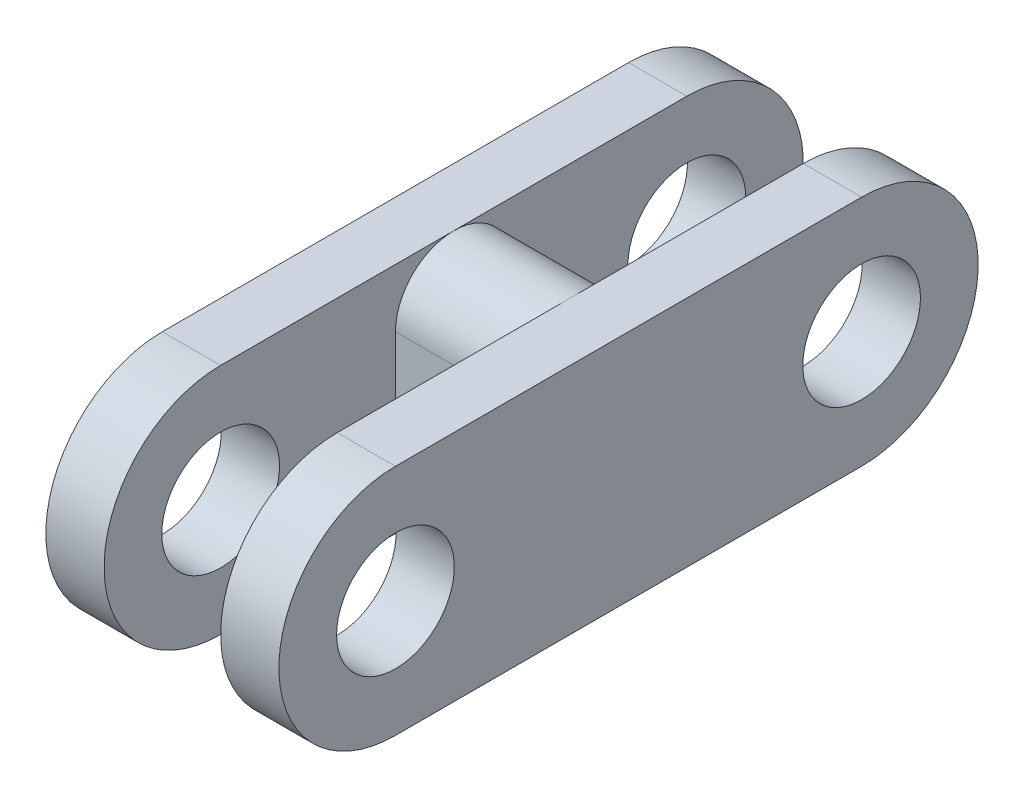
ISO-10303-21;
HEADER;
FILE_DESCRIPTION(('STEP AP214'),'2;1');
FILE_NAME('part.step','',(''),(''),'','','');
FILE_SCHEMA(('AUTOMOTIVE_DESIGN { 1 0 10303 214 1 1 1 1 }'));
ENDSEC;
DATA;
#1=APPLICATION_CONTEXT('core data for automotive mechanical design processes');
#2=APPLICATION_PROTOCOL_DEFINITION('international standard','automotive_design',2000,#1);
#3=PRODUCT_CONTEXT('',#1,'mechanical');
#4=PRODUCT('Part','Part','',(#3));
#5=PRODUCT_RELATED_PRODUCT_CATEGORY('part','',(#4));
#6=PRODUCT_DEFINITION_FORMATION('','',#4);
#7=PRODUCT_DEFINITION_CONTEXT('part definition',#1,'design');
#8=PRODUCT_DEFINITION('design','',#6,#7);
#9=PRODUCT_DEFINITION_SHAPE('','',#8);
#10=(LENGTH_UNIT() NAMED_UNIT(*) SI_UNIT(.MILLI.,.METRE.));
#11=(NAMED_UNIT(*) PLANE_ANGLE_UNIT() SI_UNIT($,.RADIAN.));
#12=(NAMED_UNIT(*) SI_UNIT($,.STERADIAN.) SOLID_ANGLE_UNIT());
#13=UNCERTAINTY_MEASURE_WITH_UNIT(LENGTH_MEASURE(1.E-05),#10,'distance_accuracy_value','');
#14=(GEOMETRIC_REPRESENTATION_CONTEXT(3) GLOBAL_UNCERTAINTY_ASSIGNED_CONTEXT((#13)) GLOBAL_UNIT_ASSIGNED_CONTEXT((#10,
#11,#12)) REPRESENTATION_CONTEXT('',''));
#15=CARTESIAN_POINT('',(0.,0.,0.));
#16=DIRECTION('',(0.,0.,1.));
#17=DIRECTION('',(1.,0.,0.));
#18=AXIS2_PLACEMENT_3D('',#15,#16,#17);
#19=CARTESIAN_POINT('',(2.5,-5.,5.));
#20=DIRECTION('',(-1.,0.,0.));
#21=DIRECTION('',(0.,0.,1.));
#22=AXIS2_PLACEMENT_3D('',#19,#20,#21);
#23=PLANE('',#22);
#24=CARTESIAN_POINT('',(2.5,-5.,25.));
#25=DIRECTION('',(-1.,0.,0.));
#26=DIRECTION('',(0.,0.,1.));
#27=AXIS2_PLACEMENT_3D('',#24,#25,#26);
#28=CIRCLE('',#27,2.52500000000001);
#29=CARTESIAN_POINT('',(2.5,-5.,27.525));
#30=VERTEX_POINT('',#29);
#31=EDGE_CURVE('E302',#30,#30,#28,.T.);
#32=ORIENTED_EDGE('',*,*,#31,.T.);
#33=EDGE_LOOP('',(#32));
#34=FACE_BOUND('',#33,.T.);
#35=DIRECTION('',(0.,-1.,0.));
#36=VECTOR('',#35,1.);
#37=CARTESIAN_POINT('',(2.5,-7.5,17.5));
#38=LINE('',#37,#36);
#39=CARTESIAN_POINT('',(2.5,-2.5,17.5));
#40=VERTEX_POINT('',#39);
#41=CARTESIAN_POINT('',(2.5,-7.5,17.5));
#42=VERTEX_POINT('',#41);
#43=EDGE_CURVE('E194',#40,#42,#38,.T.);
#44=ORIENTED_EDGE('',*,*,#43,.F.);
#45=CARTESIAN_POINT('',(2.5,-2.5,15.));
#46=DIRECTION('',(1.,0.,0.));
#47=DIRECTION('',(0.,0.,1.));
#48=AXIS2_PLACEMENT_3D('',#45,#46,#47);
#49=CIRCLE('',#48,2.5);
#50=CARTESIAN_POINT('',(2.5,0.,15.));
#51=VERTEX_POINT('',#50);
#52=EDGE_CURVE('E11',#51,#40,#49,.T.);
#53=ORIENTED_EDGE('',*,*,#52,.F.);
#54=DIRECTION('',(0.,0.,-1.));
#55=VECTOR('',#54,1.);
#56=CARTESIAN_POINT('',(2.5,0.,25.));
#57=LINE('',#56,#55);
#58=CARTESIAN_POINT('',(2.5,0.,25.));
#59=VERTEX_POINT('',#58);
#60=EDGE_CURVE('E221',#59,#51,#57,.T.);
#61=ORIENTED_EDGE('',*,*,#60,.F.);
#62=CARTESIAN_POINT('',(2.5,-5.,25.));
#63=DIRECTION('',(-1.,0.,0.));
#64=DIRECTION('',(0.,0.,1.));
#65=AXIS2_PLACEMENT_3D('',#62,#63,#64);
#66=CIRCLE('',#65,5.);
#67=CARTESIAN_POINT('',(2.5,-10.,25.));
#68=VERTEX_POINT('',#67);
#69=EDGE_CURVE('E217',#68,#59,#66,.T.);
#70=ORIENTED_EDGE('',*,*,#69,.F.);
#71=DIRECTION('',(0.,0.,1.));
#72=VECTOR('',#71,1.);
#73=CARTESIAN_POINT('',(2.5,-10.,5.));
#74=LINE('',#73,#72);
#75=CARTESIAN_POINT('',(2.5,-10.,15.));
#76=VERTEX_POINT('',#75);
#77=EDGE_CURVE('E212',#76,#68,#74,.T.);
#78=ORIENTED_EDGE('',*,*,#77,.F.);
#79=CARTESIAN_POINT('',(2.5,-7.5,15.));
#80=DIRECTION('',(1.,0.,0.));
#81=DIRECTION('',(0.,0.,1.));
#82=AXIS2_PLACEMENT_3D('',#79,#80,#81);
#83=CIRCLE('',#82,2.5);
#84=EDGE_CURVE('E171',#42,#76,#83,.T.);
#85=ORIENTED_EDGE('',*,*,#84,.F.);
#86=EDGE_LOOP('',(#44,#53,#61,#70,#78,#85));
#87=FACE_BOUND('',#86,.T.);
#88=ADVANCED_FACE('F39',(#34,#87),#23,.F.);
#89=CARTESIAN_POINT('',(2.5,-5.,5.));
#90=DIRECTION('',(-1.,0.,0.));
#91=DIRECTION('',(0.,0.,1.));
#92=AXIS2_PLACEMENT_3D('',#89,#90,#91);
#93=CIRCLE('',#92,2.52500000000001);
#94=CARTESIAN_POINT('',(2.5,-5.,7.52500000000001));
#95=VERTEX_POINT('',#94);
#96=EDGE_CURVE('E301',#95,#95,#93,.T.);
#97=ORIENTED_EDGE('',*,*,#96,.T.);
#98=EDGE_LOOP('',(#97));
#99=FACE_BOUND('',#98,.T.);
#100=CARTESIAN_POINT('',(2.5,-7.5,12.5));
#101=VERTEX_POINT('',#100);
#102=EDGE_CURVE('E48',#76,#101,#83,.T.);
#103=ORIENTED_EDGE('',*,*,#102,.F.);
#104=CARTESIAN_POINT('',(2.5,-10.,5.));
#105=VERTEX_POINT('',#104);
#106=EDGE_CURVE('E214',#105,#76,#74,.T.);
#107=ORIENTED_EDGE('',*,*,#106,.F.);
#108=CARTESIAN_POINT('',(2.5,-5.,5.));
#109=DIRECTION('',(-1.,0.,0.));
#110=DIRECTION('',(0.,0.,1.));
#111=AXIS2_PLACEMENT_3D('',#108,#109,#110);
#112=CIRCLE('',#111,5.);
#113=CARTESIAN_POINT('',(2.5,0.,5.));
#114=VERTEX_POINT('',#113);
#115=EDGE_CURVE('E209',#114,#105,#112,.T.);
#116=ORIENTED_EDGE('',*,*,#115,.F.);
#117=EDGE_CURVE('E220',#51,#114,#57,.T.);
#118=ORIENTED_EDGE('',*,*,#117,.F.);
#119=CARTESIAN_POINT('',(2.5,-2.5,12.5));
#120=VERTEX_POINT('',#119);
#121=EDGE_CURVE('E50',#120,#51,#49,.T.);
#122=ORIENTED_EDGE('',*,*,#121,.F.);
#123=DIRECTION('',(0.,1.,0.));
#124=VECTOR('',#123,1.);
#125=CARTESIAN_POINT('',(2.5,-2.5,12.5));
#126=LINE('',#125,#124);
#127=EDGE_CURVE('E174',#101,#120,#126,.T.);
#128=ORIENTED_EDGE('',*,*,#127,.F.);
#129=EDGE_LOOP('',(#103,#107,#116,#118,#122,#128));
#130=FACE_BOUND('',#129,.T.);
#131=ADVANCED_FACE('F255',(#99,#130),#23,.F.);
#132=CARTESIAN_POINT('',(2.5,-5.,5.));
#133=DIRECTION('',(-1.,0.,0.));
#134=DIRECTION('',(0.,0.,1.));
#135=AXIS2_PLACEMENT_3D('',#132,#133,#134);
#136=CYLINDRICAL_SURFACE('',#135,5.);
#137=CARTESIAN_POINT('',(0.,-5.,5.));
#138=DIRECTION('',(-1.,0.,0.));
#139=DIRECTION('',(0.,0.,1.));
#140=AXIS2_PLACEMENT_3D('',#137,#138,#139);
#141=CIRCLE('',#140,5.);
#142=CARTESIAN_POINT('',(0.,0.,5.));
#143=VERTEX_POINT('',#142);
#144=CARTESIAN_POINT('',(0.,-10.,5.));
#145=VERTEX_POINT('',#144);
#146=EDGE_CURVE('E208',#143,#145,#141,.T.);
#147=ORIENTED_EDGE('',*,*,#146,.F.);
#148=DIRECTION('',(-1.,0.,0.));
#149=VECTOR('',#148,1.);
#150=CARTESIAN_POINT('',(2.5,0.,5.));
#151=LINE('',#150,#149);
#152=EDGE_CURVE('E234',#114,#143,#151,.T.);
#153=ORIENTED_EDGE('',*,*,#152,.F.);
#154=ORIENTED_EDGE('',*,*,#115,.T.);
#155=DIRECTION('',(-1.,0.,0.));
#156=VECTOR('',#155,1.);
#157=CARTESIAN_POINT('',(2.5,-10.,5.));
#158=LINE('',#157,#156);
#159=EDGE_CURVE('E43',#105,#145,#158,.T.);
#160=ORIENTED_EDGE('',*,*,#159,.T.);
#161=EDGE_LOOP('',(#147,#153,#154,#160));
#162=FACE_BOUND('',#161,.T.);
#163=ADVANCED_FACE('F41',(#162),#136,.T.);
#164=CARTESIAN_POINT('',(2.5,0.,25.));
#165=DIRECTION('',(0.,1.,0.));
#166=DIRECTION('',(0.,0.,1.));
#167=AXIS2_PLACEMENT_3D('',#164,#165,#166);
#168=PLANE('',#167);
#169=DIRECTION('',(0.,0.,-1.));
#170=VECTOR('',#169,1.);
#171=CARTESIAN_POINT('',(0.,0.,25.));
#172=LINE('',#171,#170);
#173=CARTESIAN_POINT('',(0.,0.,25.));
#174=VERTEX_POINT('',#173);
#175=EDGE_CURVE('E213',#174,#143,#172,.T.);
#176=ORIENTED_EDGE('',*,*,#175,.F.);
#177=DIRECTION('',(-1.,0.,0.));
#178=VECTOR('',#177,1.);
#179=CARTESIAN_POINT('',(2.5,0.,25.));
#180=LINE('',#179,#178);
#181=EDGE_CURVE('E236',#59,#174,#180,.T.);
#182=ORIENTED_EDGE('',*,*,#181,.F.);
#183=ORIENTED_EDGE('',*,*,#60,.T.);
#184=ORIENTED_EDGE('',*,*,#117,.T.);
#185=ORIENTED_EDGE('',*,*,#152,.T.);
#186=EDGE_LOOP('',(#176,#182,#183,#184,#185));
#187=FACE_BOUND('',#186,.T.);
#188=ADVANCED_FACE('F252',(#187),#168,.T.);
#189=CARTESIAN_POINT('',(2.5,-5.,25.));
#190=DIRECTION('',(-1.,0.,0.));
#191=DIRECTION('',(0.,0.,1.));
#192=AXIS2_PLACEMENT_3D('',#189,#190,#191);
#193=CYLINDRICAL_SURFACE('',#192,5.);
#194=CARTESIAN_POINT('',(0.,-5.,25.));
#195=DIRECTION('',(-1.,0.,0.));
#196=DIRECTION('',(0.,0.,1.));
#197=AXIS2_PLACEMENT_3D('',#194,#195,#196);
#198=CIRCLE('',#197,5.);
#199=CARTESIAN_POINT('',(0.,-10.,25.));
#200=VERTEX_POINT('',#199);
#201=EDGE_CURVE('E229',#200,#174,#198,.T.);
#202=ORIENTED_EDGE('',*,*,#201,.F.);
#203=DIRECTION('',(-1.,0.,0.));
#204=VECTOR('',#203,1.);
#205=CARTESIAN_POINT('',(2.5,-10.,25.));
#206=LINE('',#205,#204);
#207=EDGE_CURVE('E237',#68,#200,#206,.T.);
#208=ORIENTED_EDGE('',*,*,#207,.F.);
#209=ORIENTED_EDGE('',*,*,#69,.T.);
#210=ORIENTED_EDGE('',*,*,#181,.T.);
#211=EDGE_LOOP('',(#202,#208,#209,#210));
#212=FACE_BOUND('',#211,.T.);
#213=ADVANCED_FACE('F268',(#212),#193,.T.);
#214=CARTESIAN_POINT('',(2.5,-10.,5.));
#215=DIRECTION('',(0.,-1.,0.));
#216=DIRECTION('',(0.,0.,-1.));
#217=AXIS2_PLACEMENT_3D('',#214,#215,#216);
#218=PLANE('',#217);
#219=DIRECTION('',(0.,0.,1.));
#220=VECTOR('',#219,1.);
#221=CARTESIAN_POINT('',(0.,-10.,5.));
#222=LINE('',#221,#220);
#223=EDGE_CURVE('E226',#145,#200,#222,.T.);
#224=ORIENTED_EDGE('',*,*,#223,.F.);
#225=ORIENTED_EDGE('',*,*,#159,.F.);
#226=ORIENTED_EDGE('',*,*,#106,.T.);
#227=ORIENTED_EDGE('',*,*,#77,.T.);
#228=ORIENTED_EDGE('',*,*,#207,.T.);
#229=EDGE_LOOP('',(#224,#225,#226,#227,#228));
#230=FACE_BOUND('',#229,.T.);
#231=ADVANCED_FACE('F247',(#230),#218,.T.);
#232=CARTESIAN_POINT('',(0.,-5.,5.));
#233=DIRECTION('',(-1.,0.,0.));
#234=DIRECTION('',(0.,0.,1.));
#235=AXIS2_PLACEMENT_3D('',#232,#233,#234);
#236=PLANE('',#235);
#237=CARTESIAN_POINT('',(0.,-5.,25.));
#238=DIRECTION('',(-1.,0.,0.));
#239=DIRECTION('',(0.,0.,1.));
#240=AXIS2_PLACEMENT_3D('',#237,#238,#239);
#241=CIRCLE('',#240,2.52500000000001);
#242=CARTESIAN_POINT('',(0.,-5.,27.525));
#243=VERTEX_POINT('',#242);
#244=EDGE_CURVE('E296',#243,#243,#241,.T.);
#245=ORIENTED_EDGE('',*,*,#244,.F.);
#246=EDGE_LOOP('',(#245));
#247=FACE_BOUND('',#246,.T.);
#248=CARTESIAN_POINT('',(0.,-5.,5.));
#249=DIRECTION('',(-1.,0.,0.));
#250=DIRECTION('',(0.,0.,1.));
#251=AXIS2_PLACEMENT_3D('',#248,#249,#250);
#252=CIRCLE('',#251,2.52500000000001);
#253=CARTESIAN_POINT('',(0.,-5.,7.52500000000001));
#254=VERTEX_POINT('',#253);
#255=EDGE_CURVE('E299',#254,#254,#252,.T.);
#256=ORIENTED_EDGE('',*,*,#255,.F.);
#257=EDGE_LOOP('',(#256));
#258=FACE_BOUND('',#257,.T.);
#259=ORIENTED_EDGE('',*,*,#146,.T.);
#260=ORIENTED_EDGE('',*,*,#223,.T.);
#261=ORIENTED_EDGE('',*,*,#201,.T.);
#262=ORIENTED_EDGE('',*,*,#175,.T.);
#263=EDGE_LOOP('',(#259,#260,#261,#262));
#264=FACE_BOUND('',#263,.T.);
#265=ADVANCED_FACE('F249',(#247,#258,#264),#236,.T.);
#266=CARTESIAN_POINT('',(7.5,-7.5,15.));
#267=DIRECTION('',(-1.,0.,0.));
#268=DIRECTION('',(0.,0.,1.));
#269=AXIS2_PLACEMENT_3D('',#266,#267,#268);
#270=CYLINDRICAL_SURFACE('',#269,2.5);
#271=ORIENTED_EDGE('',*,*,#84,.T.);
#272=ORIENTED_EDGE('',*,*,#102,.T.);
#273=DIRECTION('',(-1.,0.,0.));
#274=VECTOR('',#273,1.);
#275=CARTESIAN_POINT('',(7.5,-7.5,12.5));
#276=LINE('',#275,#274);
#277=CARTESIAN_POINT('',(7.5,-7.5,12.5));
#278=VERTEX_POINT('',#277);
#279=EDGE_CURVE('E205',#278,#101,#276,.T.);
#280=ORIENTED_EDGE('',*,*,#279,.F.);
#281=CARTESIAN_POINT('',(7.5,-7.5,15.));
#282=DIRECTION('',(1.,0.,0.));
#283=DIRECTION('',(0.,0.,1.));
#284=AXIS2_PLACEMENT_3D('',#281,#282,#283);
#285=CIRCLE('',#284,2.5);
#286=CARTESIAN_POINT('',(7.5,-10.,15.));
#287=VERTEX_POINT('',#286);
#288=EDGE_CURVE('E65',#287,#278,#285,.T.);
#289=ORIENTED_EDGE('',*,*,#288,.F.);
#290=CARTESIAN_POINT('',(7.5,-7.5,17.5));
#291=VERTEX_POINT('',#290);
#292=EDGE_CURVE('E180',#291,#287,#285,.T.);
#293=ORIENTED_EDGE('',*,*,#292,.F.);
#294=DIRECTION('',(-1.,0.,0.));
#295=VECTOR('',#294,1.);
#296=CARTESIAN_POINT('',(7.5,-7.5,17.5));
#297=LINE('',#296,#295);
#298=EDGE_CURVE('E189',#291,#42,#297,.T.);
#299=ORIENTED_EDGE('',*,*,#298,.T.);
#300=EDGE_LOOP('',(#271,#272,#280,#289,#293,#299));
#301=FACE_BOUND('',#300,.T.);
#302=ADVANCED_FACE('F258',(#301),#270,.T.);
#303=CARTESIAN_POINT('',(7.5,-2.5,12.5));
#304=DIRECTION('',(0.,0.,1.));
#305=DIRECTION('',(0.,-1.,0.));
#306=AXIS2_PLACEMENT_3D('',#303,#304,#305);
#307=PLANE('',#306);
#308=ORIENTED_EDGE('',*,*,#127,.T.);
#309=DIRECTION('',(-1.,0.,0.));
#310=VECTOR('',#309,1.);
#311=CARTESIAN_POINT('',(7.5,-2.5,12.5));
#312=LINE('',#311,#310);
#313=CARTESIAN_POINT('',(7.5,-2.5,12.5));
#314=VERTEX_POINT('',#313);
#315=EDGE_CURVE('E202',#314,#120,#312,.T.);
#316=ORIENTED_EDGE('',*,*,#315,.F.);
#317=DIRECTION('',(0.,1.,0.));
#318=VECTOR('',#317,1.);
#319=CARTESIAN_POINT('',(7.5,-2.5,12.5));
#320=LINE('',#319,#318);
#321=EDGE_CURVE('E182',#278,#314,#320,.T.);
#322=ORIENTED_EDGE('',*,*,#321,.F.);
#323=ORIENTED_EDGE('',*,*,#279,.T.);
#324=EDGE_LOOP('',(#308,#316,#322,#323));
#325=FACE_BOUND('',#324,.T.);
#326=ADVANCED_FACE('F292',(#325),#307,.F.);
#327=CARTESIAN_POINT('',(7.5,-2.5,15.));
#328=DIRECTION('',(-1.,0.,0.));
#329=DIRECTION('',(0.,0.,1.));
#330=AXIS2_PLACEMENT_3D('',#327,#328,#329);
#331=CYLINDRICAL_SURFACE('',#330,2.5);
#332=ORIENTED_EDGE('',*,*,#121,.T.);
#333=ORIENTED_EDGE('',*,*,#52,.T.);
#334=DIRECTION('',(-1.,0.,0.));
#335=VECTOR('',#334,1.);
#336=CARTESIAN_POINT('',(7.5,-2.5,17.5));
#337=LINE('',#336,#335);
#338=CARTESIAN_POINT('',(7.5,-2.5,17.5));
#339=VERTEX_POINT('',#338);
#340=EDGE_CURVE('E199',#339,#40,#337,.T.);
#341=ORIENTED_EDGE('',*,*,#340,.F.);
#342=CARTESIAN_POINT('',(7.5,-2.5,15.));
#343=DIRECTION('',(1.,0.,0.));
#344=DIRECTION('',(0.,0.,1.));
#345=AXIS2_PLACEMENT_3D('',#342,#343,#344);
#346=CIRCLE('',#345,2.5);
#347=CARTESIAN_POINT('',(7.5,0.,15.));
#348=VERTEX_POINT('',#347);
#349=EDGE_CURVE('E57',#348,#339,#346,.T.);
#350=ORIENTED_EDGE('',*,*,#349,.F.);
#351=EDGE_CURVE('E185',#314,#348,#346,.T.);
#352=ORIENTED_EDGE('',*,*,#351,.F.);
#353=ORIENTED_EDGE('',*,*,#315,.T.);
#354=EDGE_LOOP('',(#332,#333,#341,#350,#352,#353));
#355=FACE_BOUND('',#354,.T.);
#356=ADVANCED_FACE('F265',(#355),#331,.T.);
#357=CARTESIAN_POINT('',(7.5,-7.5,17.5));
#358=DIRECTION('',(0.,0.,-1.));
#359=DIRECTION('',(-1.,0.,0.));
#360=AXIS2_PLACEMENT_3D('',#357,#358,#359);
#361=PLANE('',#360);
#362=ORIENTED_EDGE('',*,*,#43,.T.);
#363=ORIENTED_EDGE('',*,*,#298,.F.);
#364=DIRECTION('',(0.,-1.,0.));
#365=VECTOR('',#364,1.);
#366=CARTESIAN_POINT('',(7.5,-7.5,17.5));
#367=LINE('',#366,#365);
#368=EDGE_CURVE('E187',#339,#291,#367,.T.);
#369=ORIENTED_EDGE('',*,*,#368,.F.);
#370=ORIENTED_EDGE('',*,*,#340,.T.);
#371=EDGE_LOOP('',(#362,#363,#369,#370));
#372=FACE_BOUND('',#371,.T.);
#373=ADVANCED_FACE('F263',(#372),#361,.F.);
#374=CARTESIAN_POINT('',(7.5,-5.,25.));
#375=DIRECTION('',(-1.,0.,0.));
#376=DIRECTION('',(0.,0.,1.));
#377=AXIS2_PLACEMENT_3D('',#374,#375,#376);
#378=PLANE('',#377);
#379=CARTESIAN_POINT('',(7.5,-5.,25.));
#380=DIRECTION('',(-1.,0.,0.));
#381=DIRECTION('',(0.,0.,1.));
#382=AXIS2_PLACEMENT_3D('',#379,#380,#381);
#383=CIRCLE('',#382,2.52500000000001);
#384=CARTESIAN_POINT('',(7.5,-5.,27.525));
#385=VERTEX_POINT('',#384);
#386=EDGE_CURVE('E305',#385,#385,#383,.T.);
#387=ORIENTED_EDGE('',*,*,#386,.F.);
#388=EDGE_LOOP('',(#387));
#389=FACE_BOUND('',#388,.T.);
#390=ORIENTED_EDGE('',*,*,#368,.T.);
#391=ORIENTED_EDGE('',*,*,#292,.T.);
#392=DIRECTION('',(0.,0.,-1.));
#393=VECTOR('',#392,1.);
#394=CARTESIAN_POINT('',(7.5,-10.,5.));
#395=LINE('',#394,#393);
#396=CARTESIAN_POINT('',(7.5,-10.,25.));
#397=VERTEX_POINT('',#396);
#398=EDGE_CURVE('E326',#397,#287,#395,.T.);
#399=ORIENTED_EDGE('',*,*,#398,.F.);
#400=CARTESIAN_POINT('',(7.5,-5.,25.));
#401=DIRECTION('',(1.,0.,0.));
#402=DIRECTION('',(0.,0.,1.));
#403=AXIS2_PLACEMENT_3D('',#400,#401,#402);
#404=CIRCLE('',#403,5.);
#405=CARTESIAN_POINT('',(7.5,0.,25.));
#406=VERTEX_POINT('',#405);
#407=EDGE_CURVE('E170',#406,#397,#404,.T.);
#408=ORIENTED_EDGE('',*,*,#407,.F.);
#409=DIRECTION('',(0.,0.,1.));
#410=VECTOR('',#409,1.);
#411=CARTESIAN_POINT('',(7.5,0.,25.));
#412=LINE('',#411,#410);
#413=EDGE_CURVE('E330',#348,#406,#412,.T.);
#414=ORIENTED_EDGE('',*,*,#413,.F.);
#415=ORIENTED_EDGE('',*,*,#349,.T.);
#416=EDGE_LOOP('',(#390,#391,#399,#408,#414,#415));
#417=FACE_BOUND('',#416,.T.);
#418=ADVANCED_FACE('F345',(#389,#417),#378,.T.);
#419=CARTESIAN_POINT('',(10.,-5.,25.));
#420=DIRECTION('',(-1.,0.,0.));
#421=DIRECTION('',(0.,0.,1.));
#422=AXIS2_PLACEMENT_3D('',#419,#420,#421);
#423=CYLINDRICAL_SURFACE('',#422,5.);
#424=ORIENTED_EDGE('',*,*,#407,.T.);
#425=DIRECTION('',(-1.,0.,0.));
#426=VECTOR('',#425,1.);
#427=CARTESIAN_POINT('',(10.,-10.,25.));
#428=LINE('',#427,#426);
#429=CARTESIAN_POINT('',(10.,-10.,25.));
#430=VERTEX_POINT('',#429);
#431=EDGE_CURVE('E150',#430,#397,#428,.T.);
#432=ORIENTED_EDGE('',*,*,#431,.F.);
#433=CARTESIAN_POINT('',(10.,-5.,25.));
#434=DIRECTION('',(1.,0.,0.));
#435=DIRECTION('',(0.,0.,1.));
#436=AXIS2_PLACEMENT_3D('',#433,#434,#435);
#437=CIRCLE('',#436,5.);
#438=CARTESIAN_POINT('',(10.,0.,25.));
#439=VERTEX_POINT('',#438);
#440=EDGE_CURVE('E157',#439,#430,#437,.T.);
#441=ORIENTED_EDGE('',*,*,#440,.F.);
#442=DIRECTION('',(-1.,0.,0.));
#443=VECTOR('',#442,1.);
#444=CARTESIAN_POINT('',(10.,0.,25.));
#445=LINE('',#444,#443);
#446=EDGE_CURVE('E323',#439,#406,#445,.T.);
#447=ORIENTED_EDGE('',*,*,#446,.T.);
#448=EDGE_LOOP('',(#424,#432,#441,#447));
#449=FACE_BOUND('',#448,.T.);
#450=ADVANCED_FACE('F168',(#449),#423,.T.);
#451=CARTESIAN_POINT('',(10.,-10.,5.));
#452=DIRECTION('',(0.,1.,0.));
#453=DIRECTION('',(0.,0.,1.));
#454=AXIS2_PLACEMENT_3D('',#451,#452,#453);
#455=PLANE('',#454);
#456=ORIENTED_EDGE('',*,*,#398,.T.);
#457=CARTESIAN_POINT('',(7.5,-10.,5.));
#458=VERTEX_POINT('',#457);
#459=EDGE_CURVE('E325',#287,#458,#395,.T.);
#460=ORIENTED_EDGE('',*,*,#459,.T.);
#461=DIRECTION('',(-1.,0.,0.));
#462=VECTOR('',#461,1.);
#463=CARTESIAN_POINT('',(10.,-10.,5.));
#464=LINE('',#463,#462);
#465=CARTESIAN_POINT('',(10.,-10.,5.));
#466=VERTEX_POINT('',#465);
#467=EDGE_CURVE('E153',#466,#458,#464,.T.);
#468=ORIENTED_EDGE('',*,*,#467,.F.);
#469=DIRECTION('',(0.,0.,-1.));
#470=VECTOR('',#469,1.);
#471=CARTESIAN_POINT('',(10.,-10.,5.));
#472=LINE('',#471,#470);
#473=EDGE_CURVE('E145',#430,#466,#472,.T.);
#474=ORIENTED_EDGE('',*,*,#473,.F.);
#475=ORIENTED_EDGE('',*,*,#431,.T.);
#476=EDGE_LOOP('',(#456,#460,#468,#474,#475));
#477=FACE_BOUND('',#476,.T.);
#478=ADVANCED_FACE('F148',(#477),#455,.F.);
#479=CARTESIAN_POINT('',(10.,-5.,5.));
#480=DIRECTION('',(-1.,0.,0.));
#481=DIRECTION('',(0.,0.,1.));
#482=AXIS2_PLACEMENT_3D('',#479,#480,#481);
#483=CYLINDRICAL_SURFACE('',#482,5.);
#484=CARTESIAN_POINT('',(7.5,-5.,5.));
#485=DIRECTION('',(1.,0.,0.));
#486=DIRECTION('',(0.,0.,1.));
#487=AXIS2_PLACEMENT_3D('',#484,#485,#486);
#488=CIRCLE('',#487,5.);
#489=CARTESIAN_POINT('',(7.5,0.,5.));
#490=VERTEX_POINT('',#489);
#491=EDGE_CURVE('E328',#458,#490,#488,.T.);
#492=ORIENTED_EDGE('',*,*,#491,.T.);
#493=DIRECTION('',(-1.,0.,0.));
#494=VECTOR('',#493,1.);
#495=CARTESIAN_POINT('',(10.,0.,5.));
#496=LINE('',#495,#494);
#497=CARTESIAN_POINT('',(10.,0.,5.));
#498=VERTEX_POINT('',#497);
#499=EDGE_CURVE('E176',#498,#490,#496,.T.);
#500=ORIENTED_EDGE('',*,*,#499,.F.);
#501=CARTESIAN_POINT('',(10.,-5.,5.));
#502=DIRECTION('',(1.,0.,0.));
#503=DIRECTION('',(0.,0.,1.));
#504=AXIS2_PLACEMENT_3D('',#501,#502,#503);
#505=CIRCLE('',#504,5.);
#506=EDGE_CURVE('E156',#466,#498,#505,.T.);
#507=ORIENTED_EDGE('',*,*,#506,.F.);
#508=ORIENTED_EDGE('',*,*,#467,.T.);
#509=EDGE_LOOP('',(#492,#500,#507,#508));
#510=FACE_BOUND('',#509,.T.);
#511=ADVANCED_FACE('F346',(#510),#483,.T.);
#512=CARTESIAN_POINT('',(10.,0.,25.));
#513=DIRECTION('',(0.,-1.,0.));
#514=DIRECTION('',(0.,0.,-1.));
#515=AXIS2_PLACEMENT_3D('',#512,#513,#514);
#516=PLANE('',#515);
#517=EDGE_CURVE('E166',#490,#348,#412,.T.);
#518=ORIENTED_EDGE('',*,*,#517,.T.);
#519=ORIENTED_EDGE('',*,*,#413,.T.);
#520=ORIENTED_EDGE('',*,*,#446,.F.);
#521=DIRECTION('',(0.,0.,1.));
#522=VECTOR('',#521,1.);
#523=CARTESIAN_POINT('',(10.,0.,25.));
#524=LINE('',#523,#522);
#525=EDGE_CURVE('E162',#498,#439,#524,.T.);
#526=ORIENTED_EDGE('',*,*,#525,.F.);
#527=ORIENTED_EDGE('',*,*,#499,.T.);
#528=EDGE_LOOP('',(#518,#519,#520,#526,#527));
#529=FACE_BOUND('',#528,.T.);
#530=ADVANCED_FACE('F337',(#529),#516,.F.);
#531=CARTESIAN_POINT('',(10.,-5.,25.));
#532=DIRECTION('',(-1.,0.,0.));
#533=DIRECTION('',(0.,0.,1.));
#534=AXIS2_PLACEMENT_3D('',#531,#532,#533);
#535=PLANE('',#534);
#536=CARTESIAN_POINT('',(10.,-5.,25.));
#537=DIRECTION('',(-1.,0.,0.));
#538=DIRECTION('',(0.,0.,1.));
#539=AXIS2_PLACEMENT_3D('',#536,#537,#538);
#540=CIRCLE('',#539,2.52500000000001);
#541=CARTESIAN_POINT('',(10.,-5.,27.525));
#542=VERTEX_POINT('',#541);
#543=EDGE_CURVE('E312',#542,#542,#540,.T.);
#544=ORIENTED_EDGE('',*,*,#543,.T.);
#545=EDGE_LOOP('',(#544));
#546=FACE_BOUND('',#545,.T.);
#547=CARTESIAN_POINT('',(10.,-5.,5.));
#548=DIRECTION('',(1.,0.,0.));
#549=DIRECTION('',(0.,0.,-1.));
#550=AXIS2_PLACEMENT_3D('',#547,#548,#549);
#551=CIRCLE('',#550,2.52500000000001);
#552=CARTESIAN_POINT('',(10.,-5.,2.47499999999999));
#553=VERTEX_POINT('',#552);
#554=EDGE_CURVE('E315',#553,#553,#551,.T.);
#555=ORIENTED_EDGE('',*,*,#554,.F.);
#556=EDGE_LOOP('',(#555));
#557=FACE_BOUND('',#556,.T.);
#558=ORIENTED_EDGE('',*,*,#440,.T.);
#559=ORIENTED_EDGE('',*,*,#473,.T.);
#560=ORIENTED_EDGE('',*,*,#506,.T.);
#561=ORIENTED_EDGE('',*,*,#525,.T.);
#562=EDGE_LOOP('',(#558,#559,#560,#561));
#563=FACE_BOUND('',#562,.T.);
#564=ADVANCED_FACE('F160',(#546,#557,#563),#535,.F.);
#565=CARTESIAN_POINT('',(7.5,-5.,5.));
#566=DIRECTION('',(-1.,0.,0.));
#567=DIRECTION('',(0.,0.,1.));
#568=AXIS2_PLACEMENT_3D('',#565,#566,#567);
#569=CIRCLE('',#568,2.52500000000001);
#570=CARTESIAN_POINT('',(7.5,-5.,7.52500000000001));
#571=VERTEX_POINT('',#570);
#572=EDGE_CURVE('E318',#571,#571,#569,.T.);
#573=ORIENTED_EDGE('',*,*,#572,.F.);
#574=EDGE_LOOP('',(#573));
#575=FACE_BOUND('',#574,.T.);
#576=ORIENTED_EDGE('',*,*,#459,.F.);
#577=ORIENTED_EDGE('',*,*,#288,.T.);
#578=ORIENTED_EDGE('',*,*,#321,.T.);
#579=ORIENTED_EDGE('',*,*,#351,.T.);
#580=ORIENTED_EDGE('',*,*,#517,.F.);
#581=ORIENTED_EDGE('',*,*,#491,.F.);
#582=EDGE_LOOP('',(#576,#577,#578,#579,#580,#581));
#583=FACE_BOUND('',#582,.T.);
#584=ADVANCED_FACE('F342',(#575,#583),#378,.T.);
#585=CARTESIAN_POINT('',(10.,-5.,5.));
#586=DIRECTION('',(1.,0.,0.));
#587=DIRECTION('',(0.,0.,-1.));
#588=AXIS2_PLACEMENT_3D('',#585,#586,#587);
#589=CYLINDRICAL_SURFACE('',#588,2.52500000000001);
#590=ORIENTED_EDGE('',*,*,#554,.T.);
#591=EDGE_LOOP('',(#590));
#592=FACE_BOUND('',#591,.T.);
#593=ORIENTED_EDGE('',*,*,#572,.T.);
#594=EDGE_LOOP('',(#593));
#595=FACE_BOUND('',#594,.T.);
#596=ADVANCED_FACE('F412',(#592,#595),#589,.F.);
#597=CARTESIAN_POINT('',(7.5,-5.,25.));
#598=DIRECTION('',(-1.,0.,0.));
#599=DIRECTION('',(0.,0.,1.));
#600=AXIS2_PLACEMENT_3D('',#597,#598,#599);
#601=CYLINDRICAL_SURFACE('',#600,2.52500000000001);
#602=ORIENTED_EDGE('',*,*,#543,.F.);
#603=EDGE_LOOP('',(#602));
#604=FACE_BOUND('',#603,.T.);
#605=ORIENTED_EDGE('',*,*,#386,.T.);
#606=EDGE_LOOP('',(#605));
#607=FACE_BOUND('',#606,.T.);
#608=ADVANCED_FACE('F420',(#604,#607),#601,.F.);
#609=CARTESIAN_POINT('',(0.,-5.,5.));
#610=DIRECTION('',(-1.,0.,0.));
#611=DIRECTION('',(0.,0.,1.));
#612=AXIS2_PLACEMENT_3D('',#609,#610,#611);
#613=CYLINDRICAL_SURFACE('',#612,2.52500000000001);
#614=ORIENTED_EDGE('',*,*,#255,.T.);
#615=EDGE_LOOP('',(#614));
#616=FACE_BOUND('',#615,.T.);
#617=ORIENTED_EDGE('',*,*,#96,.F.);
#618=EDGE_LOOP('',(#617));
#619=FACE_BOUND('',#618,.T.);
#620=ADVANCED_FACE('F431',(#616,#619),#613,.F.);
#621=CARTESIAN_POINT('',(0.,-5.,25.));
#622=DIRECTION('',(-1.,0.,0.));
#623=DIRECTION('',(0.,0.,1.));
#624=AXIS2_PLACEMENT_3D('',#621,#622,#623);
#625=CYLINDRICAL_SURFACE('',#624,2.52500000000001);
#626=ORIENTED_EDGE('',*,*,#244,.T.);
#627=EDGE_LOOP('',(#626));
#628=FACE_BOUND('',#627,.T.);
#629=ORIENTED_EDGE('',*,*,#31,.F.);
#630=EDGE_LOOP('',(#629));
#631=FACE_BOUND('',#630,.T.);
#632=ADVANCED_FACE('F438',(#628,#631),#625,.F.);
#633=CLOSED_SHELL('',(#88,#131,#163,#188,#213,#231,#265,#302,#326,#356,#373,#418,#450,#478,#511,
#530,#564,#584,#596,#608,#620,#632));
#634=MANIFOLD_SOLID_BREP('B2',#633);
#635=ADVANCED_BREP_SHAPE_REPRESENTATION('',(#18,#634),#14);
#636=SHAPE_DEFINITION_REPRESENTATION(#9,#635);
ENDSEC;
END-ISO-10303-21;
